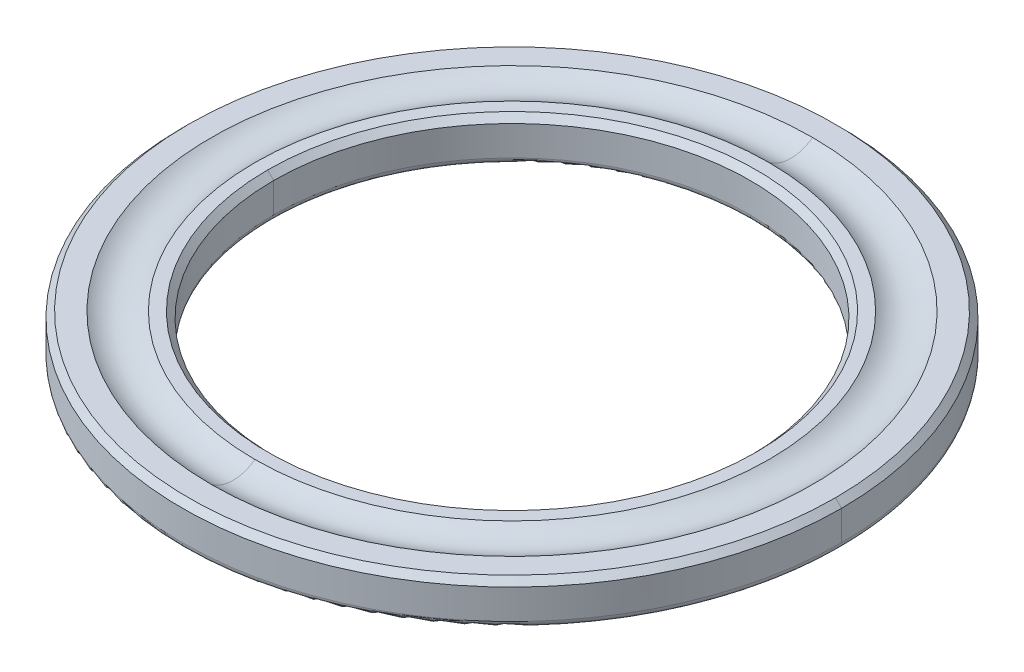
ISO-10303-21;
HEADER;
FILE_DESCRIPTION(('STEP AP214'),'2;1');
FILE_NAME('part.step','',(''),(''),'','','');
FILE_SCHEMA(('AUTOMOTIVE_DESIGN { 1 0 10303 214 1 1 1 1 }'));
ENDSEC;
DATA;
#1=APPLICATION_CONTEXT('core data for automotive mechanical design processes');
#2=APPLICATION_PROTOCOL_DEFINITION('international standard','automotive_design',2000,#1);
#3=PRODUCT_CONTEXT('',#1,'mechanical');
#4=PRODUCT('Part','Part','',(#3));
#5=PRODUCT_RELATED_PRODUCT_CATEGORY('part','',(#4));
#6=PRODUCT_DEFINITION_FORMATION('','',#4);
#7=PRODUCT_DEFINITION_CONTEXT('part definition',#1,'design');
#8=PRODUCT_DEFINITION('design','',#6,#7);
#9=PRODUCT_DEFINITION_SHAPE('','',#8);
#10=(LENGTH_UNIT() NAMED_UNIT(*) SI_UNIT(.MILLI.,.METRE.));
#11=(NAMED_UNIT(*) PLANE_ANGLE_UNIT() SI_UNIT($,.RADIAN.));
#12=(NAMED_UNIT(*) SI_UNIT($,.STERADIAN.) SOLID_ANGLE_UNIT());
#13=UNCERTAINTY_MEASURE_WITH_UNIT(LENGTH_MEASURE(1.E-05),#10,'distance_accuracy_value','');
#14=(GEOMETRIC_REPRESENTATION_CONTEXT(3) GLOBAL_UNCERTAINTY_ASSIGNED_CONTEXT((#13)) GLOBAL_UNIT_ASSIGNED_CONTEXT((#10,
#11,#12)) REPRESENTATION_CONTEXT('',''));
#15=CARTESIAN_POINT('',(0.,0.,0.));
#16=DIRECTION('',(0.,0.,1.));
#17=DIRECTION('',(1.,0.,0.));
#18=AXIS2_PLACEMENT_3D('',#15,#16,#17);
#19=CARTESIAN_POINT('',(0.,0.6,0.));
#20=DIRECTION('',(0.,1.,0.));
#21=DIRECTION('',(0.,0.,1.));
#22=AXIS2_PLACEMENT_3D('',#19,#20,#21);
#23=TOROIDAL_SURFACE('',#22,31.9,0.6);
#24=CARTESIAN_POINT('',(0.,0.6,-31.9));
#25=DIRECTION('',(1.,0.,0.));
#26=DIRECTION('',(0.,0.,-1.));
#27=AXIS2_PLACEMENT_3D('',#24,#25,#26);
#28=CIRCLE('',#27,0.6);
#29=CARTESIAN_POINT('',(0.,0.,-31.9));
#30=VERTEX_POINT('',#29);
#31=CARTESIAN_POINT('',(0.,0.6,-32.5));
#32=VERTEX_POINT('',#31);
#33=EDGE_CURVE('E226',#30,#32,#28,.T.);
#34=ORIENTED_EDGE('',*,*,#33,.F.);
#35=CARTESIAN_POINT('',(0.,0.,0.));
#36=DIRECTION('',(0.,1.,0.));
#37=DIRECTION('',(1.,0.,0.));
#38=AXIS2_PLACEMENT_3D('',#35,#36,#37);
#39=CIRCLE('',#38,31.9);
#40=CARTESIAN_POINT('',(0.,0.,31.9));
#41=VERTEX_POINT('',#40);
#42=EDGE_CURVE('E177',#30,#41,#39,.T.);
#43=ORIENTED_EDGE('',*,*,#42,.T.);
#44=CARTESIAN_POINT('',(0.,0.6,31.9));
#45=DIRECTION('',(-1.,0.,0.));
#46=DIRECTION('',(0.,0.,1.));
#47=AXIS2_PLACEMENT_3D('',#44,#45,#46);
#48=CIRCLE('',#47,0.6);
#49=CARTESIAN_POINT('',(0.,0.6,32.5));
#50=VERTEX_POINT('',#49);
#51=EDGE_CURVE('E243',#41,#50,#48,.T.);
#52=ORIENTED_EDGE('',*,*,#51,.T.);
#53=CARTESIAN_POINT('',(0.,0.6,0.));
#54=DIRECTION('',(0.,1.,0.));
#55=DIRECTION('',(1.,0.,0.));
#56=AXIS2_PLACEMENT_3D('',#53,#54,#55);
#57=CIRCLE('',#56,32.5);
#58=CARTESIAN_POINT('',(-32.5,0.6,0.));
#59=VERTEX_POINT('',#58);
#60=EDGE_CURVE('E211',#59,#50,#57,.T.);
#61=ORIENTED_EDGE('',*,*,#60,.F.);
#62=CARTESIAN_POINT('',(0.,0.6,0.));
#63=DIRECTION('',(0.,1.,0.));
#64=DIRECTION('',(1.,0.,0.));
#65=AXIS2_PLACEMENT_3D('',#62,#63,#64);
#66=CIRCLE('',#65,32.5);
#67=EDGE_CURVE('E11',#32,#59,#66,.T.);
#68=ORIENTED_EDGE('',*,*,#67,.F.);
#69=EDGE_LOOP('',(#34,#43,#52,#61,#68));
#70=FACE_BOUND('',#69,.T.);
#71=ADVANCED_FACE('F16',(#70),#23,.T.);
#72=CARTESIAN_POINT('',(0.,2.0712,0.));
#73=DIRECTION('',(0.,-1.,0.));
#74=DIRECTION('',(1.,0.,0.));
#75=AXIS2_PLACEMENT_3D('',#72,#73,#74);
#76=CYLINDRICAL_SURFACE('',#75,32.5);
#77=DIRECTION('',(0.,-1.,0.));
#78=VECTOR('',#77,1.);
#79=CARTESIAN_POINT('',(-32.5,2.0712,0.));
#80=LINE('',#79,#78);
#81=CARTESIAN_POINT('',(-32.5,3.5424,0.));
#82=VERTEX_POINT('',#81);
#83=EDGE_CURVE('E207',#82,#59,#80,.T.);
#84=ORIENTED_EDGE('',*,*,#83,.F.);
#85=CARTESIAN_POINT('',(0.,3.5424,0.));
#86=DIRECTION('',(0.,1.,0.));
#87=DIRECTION('',(1.,0.,0.));
#88=AXIS2_PLACEMENT_3D('',#85,#86,#87);
#89=CIRCLE('',#88,32.5);
#90=CARTESIAN_POINT('',(32.5,3.5424,0.));
#91=VERTEX_POINT('',#90);
#92=EDGE_CURVE('E26',#91,#82,#89,.T.);
#93=ORIENTED_EDGE('',*,*,#92,.F.);
#94=DIRECTION('',(0.,-1.,0.));
#95=VECTOR('',#94,1.);
#96=CARTESIAN_POINT('',(32.5,2.0712,0.));
#97=LINE('',#96,#95);
#98=CARTESIAN_POINT('',(32.5,0.6,0.));
#99=VERTEX_POINT('',#98);
#100=EDGE_CURVE('E192',#91,#99,#97,.T.);
#101=ORIENTED_EDGE('',*,*,#100,.T.);
#102=CARTESIAN_POINT('',(0.,0.6,0.));
#103=DIRECTION('',(0.,1.,0.));
#104=DIRECTION('',(1.,0.,0.));
#105=AXIS2_PLACEMENT_3D('',#102,#103,#104);
#106=CIRCLE('',#105,32.5);
#107=EDGE_CURVE('E231',#99,#32,#106,.T.);
#108=ORIENTED_EDGE('',*,*,#107,.T.);
#109=ORIENTED_EDGE('',*,*,#67,.T.);
#110=EDGE_LOOP('',(#84,#93,#101,#108,#109));
#111=FACE_BOUND('',#110,.T.);
#112=ADVANCED_FACE('F358',(#111),#76,.T.);
#113=CARTESIAN_POINT('',(0.,3.8424,0.));
#114=DIRECTION('',(0.,-1.,0.));
#115=DIRECTION('',(1.,0.,0.));
#116=AXIS2_PLACEMENT_3D('',#113,#114,#115);
#117=CONICAL_SURFACE('',#116,32.2,0.785398163397449);
#118=DIRECTION('',(-0.707106781186548,-0.707106781186547,0.));
#119=VECTOR('',#118,1.);
#120=CARTESIAN_POINT('',(-32.2,3.8424,0.));
#121=LINE('',#120,#119);
#122=CARTESIAN_POINT('',(-31.9,4.1424,0.));
#123=VERTEX_POINT('',#122);
#124=EDGE_CURVE('E260',#123,#82,#121,.T.);
#125=ORIENTED_EDGE('',*,*,#124,.F.);
#126=CARTESIAN_POINT('',(0.,4.1424,0.));
#127=DIRECTION('',(0.,1.,0.));
#128=DIRECTION('',(1.,0.,0.));
#129=AXIS2_PLACEMENT_3D('',#126,#127,#128);
#130=CIRCLE('',#129,31.9);
#131=CARTESIAN_POINT('',(31.9,4.1424,0.));
#132=VERTEX_POINT('',#131);
#133=EDGE_CURVE('E137',#132,#123,#130,.T.);
#134=ORIENTED_EDGE('',*,*,#133,.F.);
#135=DIRECTION('',(0.707106781186548,-0.707106781186547,0.));
#136=VECTOR('',#135,1.);
#137=CARTESIAN_POINT('',(32.2,3.8424,0.));
#138=LINE('',#137,#136);
#139=EDGE_CURVE('E257',#132,#91,#138,.T.);
#140=ORIENTED_EDGE('',*,*,#139,.T.);
#141=ORIENTED_EDGE('',*,*,#92,.T.);
#142=EDGE_LOOP('',(#125,#134,#140,#141));
#143=FACE_BOUND('',#142,.T.);
#144=ADVANCED_FACE('F362',(#143),#117,.T.);
#145=CARTESIAN_POINT('',(30.7716,4.1424,0.));
#146=DIRECTION('',(0.,1.,0.));
#147=DIRECTION('',(1.,0.,0.));
#148=AXIS2_PLACEMENT_3D('',#145,#146,#147);
#149=PLANE('',#148);
#150=CARTESIAN_POINT('',(0.,4.1424,0.));
#151=DIRECTION('',(0.,1.,0.));
#152=DIRECTION('',(1.,0.,0.));
#153=AXIS2_PLACEMENT_3D('',#150,#151,#152);
#154=CIRCLE('',#153,29.6432);
#155=CARTESIAN_POINT('',(0.,4.1424,29.6432));
#156=VERTEX_POINT('',#155);
#157=CARTESIAN_POINT('',(0.,4.1424,-29.6432));
#158=VERTEX_POINT('',#157);
#159=EDGE_CURVE('E127',#156,#158,#154,.T.);
#160=ORIENTED_EDGE('',*,*,#159,.F.);
#161=CARTESIAN_POINT('',(0.,4.1424,0.));
#162=DIRECTION('',(0.,1.,0.));
#163=DIRECTION('',(1.,0.,0.));
#164=AXIS2_PLACEMENT_3D('',#161,#162,#163);
#165=CIRCLE('',#164,29.6432);
#166=EDGE_CURVE('E132',#158,#156,#165,.T.);
#167=ORIENTED_EDGE('',*,*,#166,.F.);
#168=EDGE_LOOP('',(#160,#167));
#169=FACE_BOUND('',#168,.T.);
#170=ORIENTED_EDGE('',*,*,#133,.T.);
#171=CARTESIAN_POINT('',(0.,4.1424,0.));
#172=DIRECTION('',(0.,1.,0.));
#173=DIRECTION('',(1.,0.,0.));
#174=AXIS2_PLACEMENT_3D('',#171,#172,#173);
#175=CIRCLE('',#174,31.9);
#176=EDGE_CURVE('E255',#123,#132,#175,.T.);
#177=ORIENTED_EDGE('',*,*,#176,.T.);
#178=EDGE_LOOP('',(#170,#177));
#179=FACE_BOUND('',#178,.T.);
#180=ADVANCED_FACE('F129',(#169,#179),#149,.T.);
#181=CARTESIAN_POINT('',(0.,7.,0.));
#182=DIRECTION('',(0.,1.,0.));
#183=DIRECTION('',(0.,0.,1.));
#184=AXIS2_PLACEMENT_3D('',#181,#182,#183);
#185=TOROIDAL_SURFACE('',#184,27.5,3.572);
#186=CARTESIAN_POINT('',(0.,7.,-27.5));
#187=DIRECTION('',(1.,0.,0.));
#188=DIRECTION('',(0.,0.,-1.));
#189=AXIS2_PLACEMENT_3D('',#186,#187,#188);
#190=CIRCLE('',#189,3.572);
#191=CARTESIAN_POINT('',(0.,4.1424,-25.3568));
#192=VERTEX_POINT('',#191);
#193=EDGE_CURVE('E151',#192,#158,#190,.T.);
#194=ORIENTED_EDGE('',*,*,#193,.F.);
#195=CARTESIAN_POINT('',(0.,4.1424,0.));
#196=DIRECTION('',(0.,1.,0.));
#197=DIRECTION('',(1.,0.,0.));
#198=AXIS2_PLACEMENT_3D('',#195,#196,#197);
#199=CIRCLE('',#198,25.3568);
#200=CARTESIAN_POINT('',(0.,4.1424,25.3568));
#201=VERTEX_POINT('',#200);
#202=EDGE_CURVE('E138',#201,#192,#199,.T.);
#203=ORIENTED_EDGE('',*,*,#202,.F.);
#204=CARTESIAN_POINT('',(0.,7.,27.5));
#205=DIRECTION('',(-1.,0.,0.));
#206=DIRECTION('',(0.,0.,1.));
#207=AXIS2_PLACEMENT_3D('',#204,#205,#206);
#208=CIRCLE('',#207,3.572);
#209=EDGE_CURVE('E141',#201,#156,#208,.T.);
#210=ORIENTED_EDGE('',*,*,#209,.T.);
#211=ORIENTED_EDGE('',*,*,#159,.T.);
#212=EDGE_LOOP('',(#194,#203,#210,#211));
#213=FACE_BOUND('',#212,.T.);
#214=ADVANCED_FACE('F142',(#213),#185,.F.);
#215=CARTESIAN_POINT('',(24.7284,4.1424,0.));
#216=DIRECTION('',(0.,1.,0.));
#217=DIRECTION('',(1.,0.,0.));
#218=AXIS2_PLACEMENT_3D('',#215,#216,#217);
#219=PLANE('',#218);
#220=CARTESIAN_POINT('',(0.,4.1424,0.));
#221=DIRECTION('',(0.,1.,0.));
#222=DIRECTION('',(1.,0.,0.));
#223=AXIS2_PLACEMENT_3D('',#220,#221,#222);
#224=CIRCLE('',#223,24.1);
#225=CARTESIAN_POINT('',(24.1,4.1424,0.));
#226=VERTEX_POINT('',#225);
#227=CARTESIAN_POINT('',(-24.1,4.1424,0.));
#228=VERTEX_POINT('',#227);
#229=EDGE_CURVE('E215',#226,#228,#224,.T.);
#230=ORIENTED_EDGE('',*,*,#229,.F.);
#231=CARTESIAN_POINT('',(0.,4.1424,0.));
#232=DIRECTION('',(0.,1.,0.));
#233=DIRECTION('',(1.,0.,0.));
#234=AXIS2_PLACEMENT_3D('',#231,#232,#233);
#235=CIRCLE('',#234,24.1);
#236=EDGE_CURVE('E165',#228,#226,#235,.T.);
#237=ORIENTED_EDGE('',*,*,#236,.F.);
#238=EDGE_LOOP('',(#230,#237));
#239=FACE_BOUND('',#238,.T.);
#240=ORIENTED_EDGE('',*,*,#202,.T.);
#241=CARTESIAN_POINT('',(0.,4.1424,0.));
#242=DIRECTION('',(0.,1.,0.));
#243=DIRECTION('',(1.,0.,0.));
#244=AXIS2_PLACEMENT_3D('',#241,#242,#243);
#245=CIRCLE('',#244,25.3568);
#246=EDGE_CURVE('E158',#192,#201,#245,.T.);
#247=ORIENTED_EDGE('',*,*,#246,.T.);
#248=EDGE_LOOP('',(#240,#247));
#249=FACE_BOUND('',#248,.T.);
#250=ADVANCED_FACE('F299',(#239,#249),#219,.T.);
#251=CARTESIAN_POINT('',(0.,3.8424,0.));
#252=DIRECTION('',(0.,1.,0.));
#253=DIRECTION('',(1.,0.,0.));
#254=AXIS2_PLACEMENT_3D('',#251,#252,#253);
#255=CONICAL_SURFACE('',#254,23.8,0.785398163397446);
#256=DIRECTION('',(-0.707106781186546,0.707106781186549,0.));
#257=VECTOR('',#256,1.);
#258=CARTESIAN_POINT('',(-23.8,3.8424,0.));
#259=LINE('',#258,#257);
#260=CARTESIAN_POINT('',(-23.5,3.5424,0.));
#261=VERTEX_POINT('',#260);
#262=EDGE_CURVE('E162',#261,#228,#259,.T.);
#263=ORIENTED_EDGE('',*,*,#262,.F.);
#264=CARTESIAN_POINT('',(0.,3.5424,0.));
#265=DIRECTION('',(0.,1.,0.));
#266=DIRECTION('',(1.,0.,0.));
#267=AXIS2_PLACEMENT_3D('',#264,#265,#266);
#268=CIRCLE('',#267,23.5);
#269=CARTESIAN_POINT('',(23.5,3.5424,0.));
#270=VERTEX_POINT('',#269);
#271=EDGE_CURVE('E196',#270,#261,#268,.T.);
#272=ORIENTED_EDGE('',*,*,#271,.F.);
#273=DIRECTION('',(0.707106781186546,0.707106781186549,0.));
#274=VECTOR('',#273,1.);
#275=CARTESIAN_POINT('',(23.8,3.8424,0.));
#276=LINE('',#275,#274);
#277=EDGE_CURVE('E168',#270,#226,#276,.T.);
#278=ORIENTED_EDGE('',*,*,#277,.T.);
#279=ORIENTED_EDGE('',*,*,#229,.T.);
#280=EDGE_LOOP('',(#263,#272,#278,#279));
#281=FACE_BOUND('',#280,.T.);
#282=ADVANCED_FACE('F296',(#281),#255,.F.);
#283=CARTESIAN_POINT('',(0.,2.0712,0.));
#284=DIRECTION('',(0.,-1.,0.));
#285=DIRECTION('',(1.,0.,0.));
#286=AXIS2_PLACEMENT_3D('',#283,#284,#285);
#287=CYLINDRICAL_SURFACE('',#286,23.5);
#288=DIRECTION('',(0.,-1.,0.));
#289=VECTOR('',#288,1.);
#290=CARTESIAN_POINT('',(-23.5,2.0712,0.));
#291=LINE('',#290,#289);
#292=CARTESIAN_POINT('',(-23.5,0.6,0.));
#293=VERTEX_POINT('',#292);
#294=EDGE_CURVE('E203',#261,#293,#291,.T.);
#295=ORIENTED_EDGE('',*,*,#294,.F.);
#296=CARTESIAN_POINT('',(0.,3.5424,0.));
#297=DIRECTION('',(0.,1.,0.));
#298=DIRECTION('',(1.,0.,0.));
#299=AXIS2_PLACEMENT_3D('',#296,#297,#298);
#300=CIRCLE('',#299,23.5);
#301=EDGE_CURVE('E148',#261,#270,#300,.T.);
#302=ORIENTED_EDGE('',*,*,#301,.T.);
#303=DIRECTION('',(0.,-1.,0.));
#304=VECTOR('',#303,1.);
#305=CARTESIAN_POINT('',(23.5,2.0712,0.));
#306=LINE('',#305,#304);
#307=CARTESIAN_POINT('',(23.5,0.6,0.));
#308=VERTEX_POINT('',#307);
#309=EDGE_CURVE('E188',#270,#308,#306,.T.);
#310=ORIENTED_EDGE('',*,*,#309,.T.);
#311=CARTESIAN_POINT('',(0.,0.6,0.));
#312=DIRECTION('',(0.,1.,0.));
#313=DIRECTION('',(1.,0.,0.));
#314=AXIS2_PLACEMENT_3D('',#311,#312,#313);
#315=CIRCLE('',#314,23.5);
#316=CARTESIAN_POINT('',(0.,0.6,23.5));
#317=VERTEX_POINT('',#316);
#318=EDGE_CURVE('E180',#317,#308,#315,.T.);
#319=ORIENTED_EDGE('',*,*,#318,.F.);
#320=CARTESIAN_POINT('',(0.,0.6,0.));
#321=DIRECTION('',(0.,1.,0.));
#322=DIRECTION('',(1.,0.,0.));
#323=AXIS2_PLACEMENT_3D('',#320,#321,#322);
#324=CIRCLE('',#323,23.5);
#325=EDGE_CURVE('E76',#293,#317,#324,.T.);
#326=ORIENTED_EDGE('',*,*,#325,.F.);
#327=EDGE_LOOP('',(#295,#302,#310,#319,#326));
#328=FACE_BOUND('',#327,.T.);
#329=ADVANCED_FACE('F287',(#328),#287,.F.);
#330=CARTESIAN_POINT('',(0.,0.6,0.));
#331=DIRECTION('',(0.,1.,0.));
#332=DIRECTION('',(0.,0.,1.));
#333=AXIS2_PLACEMENT_3D('',#330,#331,#332);
#334=TOROIDAL_SURFACE('',#333,24.1,0.6);
#335=CARTESIAN_POINT('',(0.,0.6,-24.1));
#336=DIRECTION('',(1.,0.,0.));
#337=DIRECTION('',(0.,0.,-1.));
#338=AXIS2_PLACEMENT_3D('',#335,#336,#337);
#339=CIRCLE('',#338,0.6);
#340=CARTESIAN_POINT('',(0.,0.6,-23.5));
#341=VERTEX_POINT('',#340);
#342=CARTESIAN_POINT('',(0.,0.,-24.1));
#343=VERTEX_POINT('',#342);
#344=EDGE_CURVE('E87',#341,#343,#339,.T.);
#345=ORIENTED_EDGE('',*,*,#344,.F.);
#346=CARTESIAN_POINT('',(0.,0.6,0.));
#347=DIRECTION('',(0.,1.,0.));
#348=DIRECTION('',(1.,0.,0.));
#349=AXIS2_PLACEMENT_3D('',#346,#347,#348);
#350=CIRCLE('',#349,23.5);
#351=EDGE_CURVE('E19',#341,#293,#350,.T.);
#352=ORIENTED_EDGE('',*,*,#351,.T.);
#353=ORIENTED_EDGE('',*,*,#325,.T.);
#354=CARTESIAN_POINT('',(0.,0.6,24.1));
#355=DIRECTION('',(-1.,0.,0.));
#356=DIRECTION('',(0.,0.,1.));
#357=AXIS2_PLACEMENT_3D('',#354,#355,#356);
#358=CIRCLE('',#357,0.6);
#359=CARTESIAN_POINT('',(0.,0.,24.1));
#360=VERTEX_POINT('',#359);
#361=EDGE_CURVE('E171',#317,#360,#358,.T.);
#362=ORIENTED_EDGE('',*,*,#361,.T.);
#363=CARTESIAN_POINT('',(0.,0.,0.));
#364=DIRECTION('',(0.,1.,0.));
#365=DIRECTION('',(1.,0.,0.));
#366=AXIS2_PLACEMENT_3D('',#363,#364,#365);
#367=CIRCLE('',#366,24.1);
#368=EDGE_CURVE('E40',#343,#360,#367,.T.);
#369=ORIENTED_EDGE('',*,*,#368,.F.);
#370=EDGE_LOOP('',(#345,#352,#353,#362,#369));
#371=FACE_BOUND('',#370,.T.);
#372=ADVANCED_FACE('F280',(#371),#334,.T.);
#373=CARTESIAN_POINT('',(28.,0.,0.));
#374=DIRECTION('',(0.,-1.,0.));
#375=DIRECTION('',(0.,0.,-1.));
#376=AXIS2_PLACEMENT_3D('',#373,#374,#375);
#377=PLANE('',#376);
#378=CARTESIAN_POINT('',(0.,0.,0.));
#379=DIRECTION('',(0.,1.,0.));
#380=DIRECTION('',(1.,0.,0.));
#381=AXIS2_PLACEMENT_3D('',#378,#379,#380);
#382=CIRCLE('',#381,24.1);
#383=EDGE_CURVE('E169',#360,#343,#382,.T.);
#384=ORIENTED_EDGE('',*,*,#383,.T.);
#385=ORIENTED_EDGE('',*,*,#368,.T.);
#386=EDGE_LOOP('',(#384,#385));
#387=FACE_BOUND('',#386,.T.);
#388=CARTESIAN_POINT('',(0.,0.,0.));
#389=DIRECTION('',(0.,1.,0.));
#390=DIRECTION('',(1.,0.,0.));
#391=AXIS2_PLACEMENT_3D('',#388,#389,#390);
#392=CIRCLE('',#391,31.9);
#393=EDGE_CURVE('E223',#41,#30,#392,.T.);
#394=ORIENTED_EDGE('',*,*,#393,.F.);
#395=ORIENTED_EDGE('',*,*,#42,.F.);
#396=EDGE_LOOP('',(#394,#395));
#397=FACE_BOUND('',#396,.T.);
#398=ADVANCED_FACE('F346',(#387,#397),#377,.T.);
#399=CARTESIAN_POINT('',(0.,0.6,0.));
#400=DIRECTION('',(0.,1.,0.));
#401=DIRECTION('',(0.,0.,1.));
#402=AXIS2_PLACEMENT_3D('',#399,#400,#401);
#403=TOROIDAL_SURFACE('',#402,24.1,0.6);
#404=ORIENTED_EDGE('',*,*,#318,.T.);
#405=CARTESIAN_POINT('',(0.,0.6,0.));
#406=DIRECTION('',(0.,1.,0.));
#407=DIRECTION('',(1.,0.,0.));
#408=AXIS2_PLACEMENT_3D('',#405,#406,#407);
#409=CIRCLE('',#408,23.5);
#410=EDGE_CURVE('E230',#308,#341,#409,.T.);
#411=ORIENTED_EDGE('',*,*,#410,.T.);
#412=ORIENTED_EDGE('',*,*,#344,.T.);
#413=ORIENTED_EDGE('',*,*,#383,.F.);
#414=ORIENTED_EDGE('',*,*,#361,.F.);
#415=EDGE_LOOP('',(#404,#411,#412,#413,#414));
#416=FACE_BOUND('',#415,.T.);
#417=ADVANCED_FACE('F348',(#416),#403,.T.);
#418=CARTESIAN_POINT('',(0.,2.0712,0.));
#419=DIRECTION('',(0.,-1.,0.));
#420=DIRECTION('',(1.,0.,0.));
#421=AXIS2_PLACEMENT_3D('',#418,#419,#420);
#422=CYLINDRICAL_SURFACE('',#421,23.5);
#423=ORIENTED_EDGE('',*,*,#271,.T.);
#424=ORIENTED_EDGE('',*,*,#294,.T.);
#425=ORIENTED_EDGE('',*,*,#351,.F.);
#426=ORIENTED_EDGE('',*,*,#410,.F.);
#427=ORIENTED_EDGE('',*,*,#309,.F.);
#428=EDGE_LOOP('',(#423,#424,#425,#426,#427));
#429=FACE_BOUND('',#428,.T.);
#430=ADVANCED_FACE('F283',(#429),#422,.F.);
#431=CARTESIAN_POINT('',(0.,3.8424,0.));
#432=DIRECTION('',(0.,1.,0.));
#433=DIRECTION('',(1.,0.,0.));
#434=AXIS2_PLACEMENT_3D('',#431,#432,#433);
#435=CONICAL_SURFACE('',#434,23.8,0.785398163397446);
#436=ORIENTED_EDGE('',*,*,#301,.F.);
#437=ORIENTED_EDGE('',*,*,#262,.T.);
#438=ORIENTED_EDGE('',*,*,#236,.T.);
#439=ORIENTED_EDGE('',*,*,#277,.F.);
#440=EDGE_LOOP('',(#436,#437,#438,#439));
#441=FACE_BOUND('',#440,.T.);
#442=ADVANCED_FACE('F293',(#441),#435,.F.);
#443=CARTESIAN_POINT('',(0.,7.,0.));
#444=DIRECTION('',(0.,1.,0.));
#445=DIRECTION('',(0.,0.,1.));
#446=AXIS2_PLACEMENT_3D('',#443,#444,#445);
#447=TOROIDAL_SURFACE('',#446,27.5,3.572);
#448=ORIENTED_EDGE('',*,*,#246,.F.);
#449=ORIENTED_EDGE('',*,*,#193,.T.);
#450=ORIENTED_EDGE('',*,*,#166,.T.);
#451=ORIENTED_EDGE('',*,*,#209,.F.);
#452=EDGE_LOOP('',(#448,#449,#450,#451));
#453=FACE_BOUND('',#452,.T.);
#454=ADVANCED_FACE('F150',(#453),#447,.F.);
#455=CARTESIAN_POINT('',(0.,3.8424,0.));
#456=DIRECTION('',(0.,-1.,0.));
#457=DIRECTION('',(1.,0.,0.));
#458=AXIS2_PLACEMENT_3D('',#455,#456,#457);
#459=CONICAL_SURFACE('',#458,32.2,0.785398163397449);
#460=ORIENTED_EDGE('',*,*,#176,.F.);
#461=ORIENTED_EDGE('',*,*,#124,.T.);
#462=CARTESIAN_POINT('',(0.,3.5424,0.));
#463=DIRECTION('',(0.,1.,0.));
#464=DIRECTION('',(1.,0.,0.));
#465=AXIS2_PLACEMENT_3D('',#462,#463,#464);
#466=CIRCLE('',#465,32.5);
#467=EDGE_CURVE('E212',#82,#91,#466,.T.);
#468=ORIENTED_EDGE('',*,*,#467,.T.);
#469=ORIENTED_EDGE('',*,*,#139,.F.);
#470=EDGE_LOOP('',(#460,#461,#468,#469));
#471=FACE_BOUND('',#470,.T.);
#472=ADVANCED_FACE('F329',(#471),#459,.T.);
#473=CARTESIAN_POINT('',(0.,2.0712,0.));
#474=DIRECTION('',(0.,-1.,0.));
#475=DIRECTION('',(1.,0.,0.));
#476=AXIS2_PLACEMENT_3D('',#473,#474,#475);
#477=CYLINDRICAL_SURFACE('',#476,32.5);
#478=ORIENTED_EDGE('',*,*,#467,.F.);
#479=ORIENTED_EDGE('',*,*,#83,.T.);
#480=ORIENTED_EDGE('',*,*,#60,.T.);
#481=CARTESIAN_POINT('',(0.,0.6,0.));
#482=DIRECTION('',(0.,1.,0.));
#483=DIRECTION('',(1.,0.,0.));
#484=AXIS2_PLACEMENT_3D('',#481,#482,#483);
#485=CIRCLE('',#484,32.5);
#486=EDGE_CURVE('E234',#50,#99,#485,.T.);
#487=ORIENTED_EDGE('',*,*,#486,.T.);
#488=ORIENTED_EDGE('',*,*,#100,.F.);
#489=EDGE_LOOP('',(#478,#479,#480,#487,#488));
#490=FACE_BOUND('',#489,.T.);
#491=ADVANCED_FACE('F371',(#490),#477,.T.);
#492=CARTESIAN_POINT('',(0.,0.6,0.));
#493=DIRECTION('',(0.,1.,0.));
#494=DIRECTION('',(0.,0.,1.));
#495=AXIS2_PLACEMENT_3D('',#492,#493,#494);
#496=TOROIDAL_SURFACE('',#495,31.9,0.6);
#497=ORIENTED_EDGE('',*,*,#393,.T.);
#498=ORIENTED_EDGE('',*,*,#33,.T.);
#499=ORIENTED_EDGE('',*,*,#107,.F.);
#500=ORIENTED_EDGE('',*,*,#486,.F.);
#501=ORIENTED_EDGE('',*,*,#51,.F.);
#502=EDGE_LOOP('',(#497,#498,#499,#500,#501));
#503=FACE_BOUND('',#502,.T.);
#504=ADVANCED_FACE('F345',(#503),#496,.T.);
#505=CLOSED_SHELL('',(#71,#112,#144,#180,#214,#250,#282,#329,#372,#398,#417,#430,#442,#454,#472,
#491,#504));
#506=MANIFOLD_SOLID_BREP('B1',#505);
#507=ADVANCED_BREP_SHAPE_REPRESENTATION('',(#18,#506),#14);
#508=SHAPE_DEFINITION_REPRESENTATION(#9,#507);
ENDSEC;
END-ISO-10303-21;
